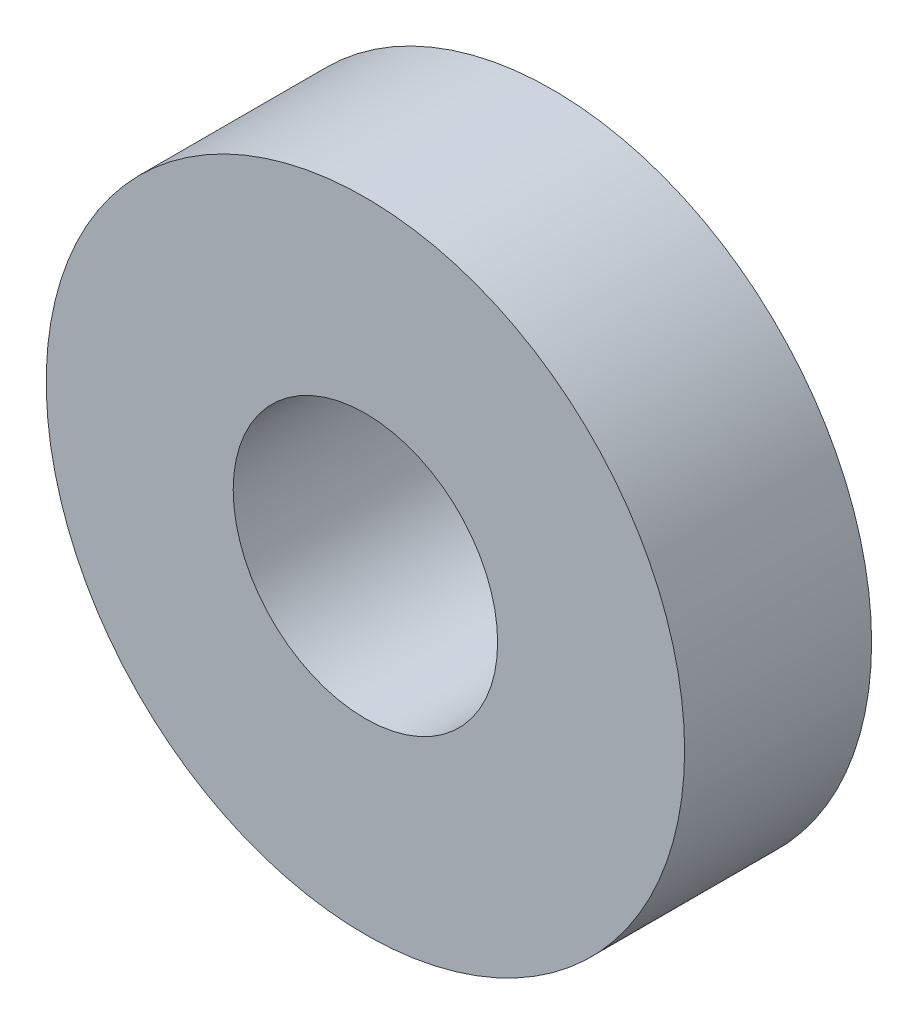
ISO-10303-21;
HEADER;
FILE_DESCRIPTION(('STEP AP214'),'2;1');
FILE_NAME('part.step','',(''),(''),'','','');
FILE_SCHEMA(('AUTOMOTIVE_DESIGN { 1 0 10303 214 1 1 1 1 }'));
ENDSEC;
DATA;
#1=APPLICATION_CONTEXT('core data for automotive mechanical design processes');
#2=APPLICATION_PROTOCOL_DEFINITION('international standard','automotive_design',2000,#1);
#3=PRODUCT_CONTEXT('',#1,'mechanical');
#4=PRODUCT('Part','Part','',(#3));
#5=PRODUCT_RELATED_PRODUCT_CATEGORY('part','',(#4));
#6=PRODUCT_DEFINITION_FORMATION('','',#4);
#7=PRODUCT_DEFINITION_CONTEXT('part definition',#1,'design');
#8=PRODUCT_DEFINITION('design','',#6,#7);
#9=PRODUCT_DEFINITION_SHAPE('','',#8);
#10=(LENGTH_UNIT() NAMED_UNIT(*) SI_UNIT(.MILLI.,.METRE.));
#11=(NAMED_UNIT(*) PLANE_ANGLE_UNIT() SI_UNIT($,.RADIAN.));
#12=(NAMED_UNIT(*) SI_UNIT($,.STERADIAN.) SOLID_ANGLE_UNIT());
#13=UNCERTAINTY_MEASURE_WITH_UNIT(LENGTH_MEASURE(1.E-05),#10,'distance_accuracy_value','');
#14=(GEOMETRIC_REPRESENTATION_CONTEXT(3) GLOBAL_UNCERTAINTY_ASSIGNED_CONTEXT((#13)) GLOBAL_UNIT_ASSIGNED_CONTEXT((#10,
#11,#12)) REPRESENTATION_CONTEXT('',''));
#15=CARTESIAN_POINT('',(0.,0.,0.));
#16=DIRECTION('',(0.,0.,1.));
#17=DIRECTION('',(1.,0.,0.));
#18=AXIS2_PLACEMENT_3D('',#15,#16,#17);
#19=CARTESIAN_POINT('',(0.,0.,6.35));
#20=DIRECTION('',(0.,0.,-1.));
#21=DIRECTION('',(-1.,0.,0.));
#22=AXIS2_PLACEMENT_3D('',#19,#20,#21);
#23=CYLINDRICAL_SURFACE('',#22,10.84);
#24=CARTESIAN_POINT('',(0.,0.,6.35));
#25=DIRECTION('',(0.,0.,1.));
#26=DIRECTION('',(1.,0.,0.));
#27=AXIS2_PLACEMENT_3D('',#24,#25,#26);
#28=CIRCLE('',#27,10.84);
#29=CARTESIAN_POINT('',(10.84,0.,6.35));
#30=VERTEX_POINT('',#29);
#31=EDGE_CURVE('E10',#30,#30,#28,.T.);
#32=ORIENTED_EDGE('',*,*,#31,.F.);
#33=EDGE_LOOP('',(#32));
#34=FACE_BOUND('',#33,.T.);
#35=CARTESIAN_POINT('',(0.,0.,0.));
#36=DIRECTION('',(0.,0.,1.));
#37=DIRECTION('',(1.,0.,0.));
#38=AXIS2_PLACEMENT_3D('',#35,#36,#37);
#39=CIRCLE('',#38,10.84);
#40=CARTESIAN_POINT('',(10.84,0.,0.));
#41=VERTEX_POINT('',#40);
#42=EDGE_CURVE('E31',#41,#41,#39,.T.);
#43=ORIENTED_EDGE('',*,*,#42,.T.);
#44=EDGE_LOOP('',(#43));
#45=FACE_BOUND('',#44,.T.);
#46=ADVANCED_FACE('F28',(#34,#45),#23,.T.);
#47=CARTESIAN_POINT('',(0.,0.,6.35));
#48=DIRECTION('',(0.,0.,1.));
#49=DIRECTION('',(1.,0.,0.));
#50=AXIS2_PLACEMENT_3D('',#47,#48,#49);
#51=PLANE('',#50);
#52=CARTESIAN_POINT('',(0.,0.,6.35));
#53=DIRECTION('',(0.,0.,1.));
#54=DIRECTION('',(1.,0.,0.));
#55=AXIS2_PLACEMENT_3D('',#52,#53,#54);
#56=CIRCLE('',#55,4.49012806053458);
#57=CARTESIAN_POINT('',(4.49012806053458,0.,6.35));
#58=VERTEX_POINT('',#57);
#59=EDGE_CURVE('E40',#58,#58,#56,.T.);
#60=ORIENTED_EDGE('',*,*,#59,.F.);
#61=EDGE_LOOP('',(#60));
#62=FACE_BOUND('',#61,.T.);
#63=ORIENTED_EDGE('',*,*,#31,.T.);
#64=EDGE_LOOP('',(#63));
#65=FACE_BOUND('',#64,.T.);
#66=ADVANCED_FACE('F55',(#62,#65),#51,.T.);
#67=CARTESIAN_POINT('',(0.,0.,0.));
#68=DIRECTION('',(0.,0.,1.));
#69=DIRECTION('',(1.,0.,0.));
#70=AXIS2_PLACEMENT_3D('',#67,#68,#69);
#71=PLANE('',#70);
#72=CARTESIAN_POINT('',(0.,0.,0.));
#73=DIRECTION('',(0.,0.,1.));
#74=DIRECTION('',(1.,0.,0.));
#75=AXIS2_PLACEMENT_3D('',#72,#73,#74);
#76=CIRCLE('',#75,4.49012806053458);
#77=CARTESIAN_POINT('',(4.49012806053458,0.,0.));
#78=VERTEX_POINT('',#77);
#79=EDGE_CURVE('E38',#78,#78,#76,.T.);
#80=ORIENTED_EDGE('',*,*,#79,.T.);
#81=EDGE_LOOP('',(#80));
#82=FACE_BOUND('',#81,.T.);
#83=ORIENTED_EDGE('',*,*,#42,.F.);
#84=EDGE_LOOP('',(#83));
#85=FACE_BOUND('',#84,.T.);
#86=ADVANCED_FACE('F46',(#82,#85),#71,.F.);
#87=CARTESIAN_POINT('',(0.,0.,0.));
#88=DIRECTION('',(0.,0.,1.));
#89=DIRECTION('',(1.,0.,0.));
#90=AXIS2_PLACEMENT_3D('',#87,#88,#89);
#91=CYLINDRICAL_SURFACE('',#90,4.49012806053458);
#92=ORIENTED_EDGE('',*,*,#79,.F.);
#93=EDGE_LOOP('',(#92));
#94=FACE_BOUND('',#93,.T.);
#95=ORIENTED_EDGE('',*,*,#59,.T.);
#96=EDGE_LOOP('',(#95));
#97=FACE_BOUND('',#96,.T.);
#98=ADVANCED_FACE('F49',(#94,#97),#91,.F.);
#99=CLOSED_SHELL('',(#46,#66,#86,#98));
#100=MANIFOLD_SOLID_BREP('B2',#99);
#101=ADVANCED_BREP_SHAPE_REPRESENTATION('',(#18,#100),#14);
#102=SHAPE_DEFINITION_REPRESENTATION(#9,#101);
ENDSEC;
END-ISO-10303-21;
